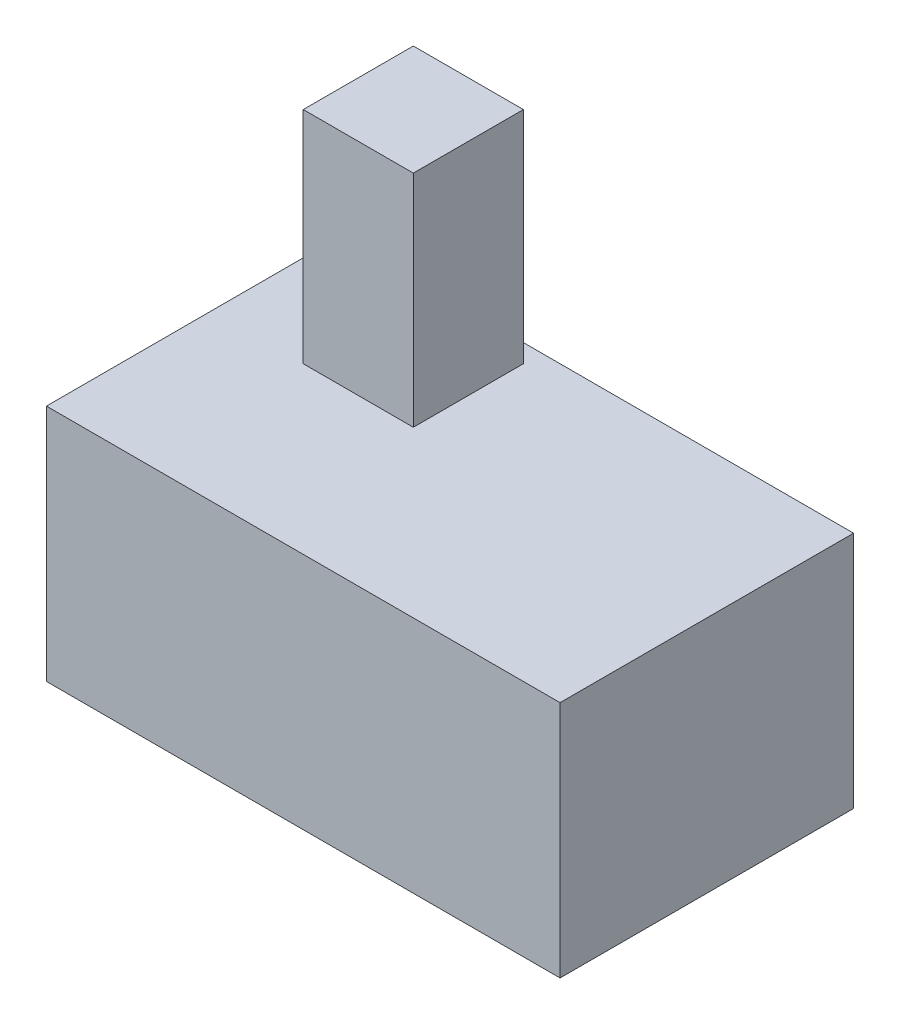
ISO-10303-21;
HEADER;
FILE_DESCRIPTION(('STEP AP214'),'2;1');
FILE_NAME('part.step','',(''),(''),'','','');
FILE_SCHEMA(('AUTOMOTIVE_DESIGN { 1 0 10303 214 1 1 1 1 }'));
ENDSEC;
DATA;
#1=APPLICATION_CONTEXT('core data for automotive mechanical design processes');
#2=APPLICATION_PROTOCOL_DEFINITION('international standard','automotive_design',2000,#1);
#3=PRODUCT_CONTEXT('',#1,'mechanical');
#4=PRODUCT('Part','Part','',(#3));
#5=PRODUCT_RELATED_PRODUCT_CATEGORY('part','',(#4));
#6=PRODUCT_DEFINITION_FORMATION('','',#4);
#7=PRODUCT_DEFINITION_CONTEXT('part definition',#1,'design');
#8=PRODUCT_DEFINITION('design','',#6,#7);
#9=PRODUCT_DEFINITION_SHAPE('','',#8);
#10=(LENGTH_UNIT() NAMED_UNIT(*) SI_UNIT(.MILLI.,.METRE.));
#11=(NAMED_UNIT(*) PLANE_ANGLE_UNIT() SI_UNIT($,.RADIAN.));
#12=(NAMED_UNIT(*) SI_UNIT($,.STERADIAN.) SOLID_ANGLE_UNIT());
#13=UNCERTAINTY_MEASURE_WITH_UNIT(LENGTH_MEASURE(1.E-05),#10,'distance_accuracy_value','');
#14=(GEOMETRIC_REPRESENTATION_CONTEXT(3) GLOBAL_UNCERTAINTY_ASSIGNED_CONTEXT((#13)) GLOBAL_UNIT_ASSIGNED_CONTEXT((#10,
#11,#12)) REPRESENTATION_CONTEXT('',''));
#15=CARTESIAN_POINT('',(0.,0.,0.));
#16=DIRECTION('',(0.,0.,1.));
#17=DIRECTION('',(1.,0.,0.));
#18=AXIS2_PLACEMENT_3D('',#15,#16,#17);
#19=CARTESIAN_POINT('',(0.,6.5,0.));
#20=DIRECTION('',(0.,-1.,0.));
#21=DIRECTION('',(0.,0.,-1.));
#22=AXIS2_PLACEMENT_3D('',#19,#20,#21);
#23=PLANE('',#22);
#24=DIRECTION('',(0.,0.,-1.));
#25=VECTOR('',#24,1.);
#26=CARTESIAN_POINT('',(7.,6.5,4.00000000000002));
#27=LINE('',#26,#25);
#28=CARTESIAN_POINT('',(7.,6.5,4.00000000000002));
#29=VERTEX_POINT('',#28);
#30=CARTESIAN_POINT('',(7.,6.5,-3.99999999999999));
#31=VERTEX_POINT('',#30);
#32=EDGE_CURVE('E130',#29,#31,#27,.T.);
#33=ORIENTED_EDGE('',*,*,#32,.T.);
#34=DIRECTION('',(-1.,0.,0.));
#35=VECTOR('',#34,1.);
#36=CARTESIAN_POINT('',(-7.,6.5,-3.99999999999999));
#37=LINE('',#36,#35);
#38=CARTESIAN_POINT('',(-7.,6.5,-3.99999999999999));
#39=VERTEX_POINT('',#38);
#40=EDGE_CURVE('E133',#31,#39,#37,.T.);
#41=ORIENTED_EDGE('',*,*,#40,.T.);
#42=DIRECTION('',(0.,0.,1.));
#43=VECTOR('',#42,1.);
#44=CARTESIAN_POINT('',(-7.,6.5,4.00000000000002));
#45=LINE('',#44,#43);
#46=CARTESIAN_POINT('',(-7.,6.5,4.00000000000002));
#47=VERTEX_POINT('',#46);
#48=EDGE_CURVE('E136',#39,#47,#45,.T.);
#49=ORIENTED_EDGE('',*,*,#48,.T.);
#50=DIRECTION('',(1.,0.,0.));
#51=VECTOR('',#50,1.);
#52=CARTESIAN_POINT('',(-7.,6.5,4.00000000000002));
#53=LINE('',#52,#51);
#54=EDGE_CURVE('E138',#47,#29,#53,.T.);
#55=ORIENTED_EDGE('',*,*,#54,.T.);
#56=EDGE_LOOP('',(#33,#41,#49,#55));
#57=FACE_BOUND('',#56,.T.);
#58=DIRECTION('',(0.,0.,-1.));
#59=VECTOR('',#58,1.);
#60=CARTESIAN_POINT('',(-1.5,6.5,-0.49999999999999));
#61=LINE('',#60,#59);
#62=CARTESIAN_POINT('',(-1.5,6.5,-0.49999999999999));
#63=VERTEX_POINT('',#62);
#64=CARTESIAN_POINT('',(-1.5,6.5,-3.49999999999999));
#65=VERTEX_POINT('',#64);
#66=EDGE_CURVE('E120',#63,#65,#61,.T.);
#67=ORIENTED_EDGE('',*,*,#66,.F.);
#68=DIRECTION('',(1.,0.,0.));
#69=VECTOR('',#68,1.);
#70=CARTESIAN_POINT('',(-4.5,6.5,-0.49999999999999));
#71=LINE('',#70,#69);
#72=CARTESIAN_POINT('',(-4.5,6.5,-0.49999999999999));
#73=VERTEX_POINT('',#72);
#74=EDGE_CURVE('E117',#73,#63,#71,.T.);
#75=ORIENTED_EDGE('',*,*,#74,.F.);
#76=DIRECTION('',(0.,0.,1.));
#77=VECTOR('',#76,1.);
#78=CARTESIAN_POINT('',(-4.5,6.5,-0.49999999999999));
#79=LINE('',#78,#77);
#80=CARTESIAN_POINT('',(-4.5,6.5,-3.49999999999999));
#81=VERTEX_POINT('',#80);
#82=EDGE_CURVE('E55',#81,#73,#79,.T.);
#83=ORIENTED_EDGE('',*,*,#82,.F.);
#84=DIRECTION('',(-1.,0.,0.));
#85=VECTOR('',#84,1.);
#86=CARTESIAN_POINT('',(-4.5,6.5,-3.49999999999999));
#87=LINE('',#86,#85);
#88=EDGE_CURVE('E50',#65,#81,#87,.T.);
#89=ORIENTED_EDGE('',*,*,#88,.F.);
#90=EDGE_LOOP('',(#67,#75,#83,#89));
#91=FACE_BOUND('',#90,.T.);
#92=ADVANCED_FACE('F35',(#57,#91),#23,.F.);
#93=CARTESIAN_POINT('',(7.,6.5,4.00000000000002));
#94=DIRECTION('',(-1.,0.,0.));
#95=DIRECTION('',(0.,0.,1.));
#96=AXIS2_PLACEMENT_3D('',#93,#94,#95);
#97=PLANE('',#96);
#98=DIRECTION('',(0.,0.,-1.));
#99=VECTOR('',#98,1.);
#100=CARTESIAN_POINT('',(7.,0.,4.00000000000002));
#101=LINE('',#100,#99);
#102=CARTESIAN_POINT('',(7.,0.,4.00000000000002));
#103=VERTEX_POINT('',#102);
#104=CARTESIAN_POINT('',(7.,0.,-3.99999999999999));
#105=VERTEX_POINT('',#104);
#106=EDGE_CURVE('E121',#103,#105,#101,.T.);
#107=ORIENTED_EDGE('',*,*,#106,.T.);
#108=DIRECTION('',(0.,-1.,0.));
#109=VECTOR('',#108,1.);
#110=CARTESIAN_POINT('',(7.,6.5,-3.99999999999999));
#111=LINE('',#110,#109);
#112=EDGE_CURVE('E11',#31,#105,#111,.T.);
#113=ORIENTED_EDGE('',*,*,#112,.F.);
#114=ORIENTED_EDGE('',*,*,#32,.F.);
#115=DIRECTION('',(0.,-1.,0.));
#116=VECTOR('',#115,1.);
#117=CARTESIAN_POINT('',(7.,6.5,4.00000000000002));
#118=LINE('',#117,#116);
#119=EDGE_CURVE('E139',#29,#103,#118,.T.);
#120=ORIENTED_EDGE('',*,*,#119,.T.);
#121=EDGE_LOOP('',(#107,#113,#114,#120));
#122=FACE_BOUND('',#121,.T.);
#123=ADVANCED_FACE('F37',(#122),#97,.F.);
#124=CARTESIAN_POINT('',(-7.,6.5,-3.99999999999999));
#125=DIRECTION('',(0.,0.,1.));
#126=DIRECTION('',(1.,0.,0.));
#127=AXIS2_PLACEMENT_3D('',#124,#125,#126);
#128=PLANE('',#127);
#129=DIRECTION('',(-1.,0.,0.));
#130=VECTOR('',#129,1.);
#131=CARTESIAN_POINT('',(-7.,0.,-3.99999999999999));
#132=LINE('',#131,#130);
#133=CARTESIAN_POINT('',(-7.,0.,-3.99999999999999));
#134=VERTEX_POINT('',#133);
#135=EDGE_CURVE('E124',#105,#134,#132,.T.);
#136=ORIENTED_EDGE('',*,*,#135,.T.);
#137=DIRECTION('',(0.,-1.,0.));
#138=VECTOR('',#137,1.);
#139=CARTESIAN_POINT('',(-7.,6.5,-3.99999999999999));
#140=LINE('',#139,#138);
#141=EDGE_CURVE('E43',#39,#134,#140,.T.);
#142=ORIENTED_EDGE('',*,*,#141,.F.);
#143=ORIENTED_EDGE('',*,*,#40,.F.);
#144=ORIENTED_EDGE('',*,*,#112,.T.);
#145=EDGE_LOOP('',(#136,#142,#143,#144));
#146=FACE_BOUND('',#145,.T.);
#147=ADVANCED_FACE('F169',(#146),#128,.F.);
#148=CARTESIAN_POINT('',(-7.,6.5,4.00000000000002));
#149=DIRECTION('',(1.,0.,0.));
#150=DIRECTION('',(0.,0.,-1.));
#151=AXIS2_PLACEMENT_3D('',#148,#149,#150);
#152=PLANE('',#151);
#153=DIRECTION('',(0.,0.,1.));
#154=VECTOR('',#153,1.);
#155=CARTESIAN_POINT('',(-7.,0.,4.00000000000002));
#156=LINE('',#155,#154);
#157=CARTESIAN_POINT('',(-7.,0.,4.00000000000002));
#158=VERTEX_POINT('',#157);
#159=EDGE_CURVE('E142',#134,#158,#156,.T.);
#160=ORIENTED_EDGE('',*,*,#159,.T.);
#161=DIRECTION('',(0.,-1.,0.));
#162=VECTOR('',#161,1.);
#163=CARTESIAN_POINT('',(-7.,6.5,4.00000000000002));
#164=LINE('',#163,#162);
#165=EDGE_CURVE('E147',#47,#158,#164,.T.);
#166=ORIENTED_EDGE('',*,*,#165,.F.);
#167=ORIENTED_EDGE('',*,*,#48,.F.);
#168=ORIENTED_EDGE('',*,*,#141,.T.);
#169=EDGE_LOOP('',(#160,#166,#167,#168));
#170=FACE_BOUND('',#169,.T.);
#171=ADVANCED_FACE('F154',(#170),#152,.F.);
#172=CARTESIAN_POINT('',(-7.,6.5,4.00000000000002));
#173=DIRECTION('',(0.,0.,-1.));
#174=DIRECTION('',(-1.,0.,0.));
#175=AXIS2_PLACEMENT_3D('',#172,#173,#174);
#176=PLANE('',#175);
#177=DIRECTION('',(1.,0.,0.));
#178=VECTOR('',#177,1.);
#179=CARTESIAN_POINT('',(-7.,0.,4.00000000000002));
#180=LINE('',#179,#178);
#181=EDGE_CURVE('E134',#158,#103,#180,.T.);
#182=ORIENTED_EDGE('',*,*,#181,.T.);
#183=ORIENTED_EDGE('',*,*,#119,.F.);
#184=ORIENTED_EDGE('',*,*,#54,.F.);
#185=ORIENTED_EDGE('',*,*,#165,.T.);
#186=EDGE_LOOP('',(#182,#183,#184,#185));
#187=FACE_BOUND('',#186,.T.);
#188=ADVANCED_FACE('F163',(#187),#176,.F.);
#189=CARTESIAN_POINT('',(0.,0.,0.));
#190=DIRECTION('',(0.,-1.,0.));
#191=DIRECTION('',(0.,0.,-1.));
#192=AXIS2_PLACEMENT_3D('',#189,#190,#191);
#193=PLANE('',#192);
#194=ORIENTED_EDGE('',*,*,#106,.F.);
#195=ORIENTED_EDGE('',*,*,#181,.F.);
#196=ORIENTED_EDGE('',*,*,#159,.F.);
#197=ORIENTED_EDGE('',*,*,#135,.F.);
#198=EDGE_LOOP('',(#194,#195,#196,#197));
#199=FACE_BOUND('',#198,.T.);
#200=ADVANCED_FACE('F160',(#199),#193,.T.);
#201=CARTESIAN_POINT('',(-1.5,12.5,-0.49999999999999));
#202=DIRECTION('',(-1.,0.,0.));
#203=DIRECTION('',(0.,0.,1.));
#204=AXIS2_PLACEMENT_3D('',#201,#202,#203);
#205=PLANE('',#204);
#206=ORIENTED_EDGE('',*,*,#66,.T.);
#207=DIRECTION('',(0.,-1.,0.));
#208=VECTOR('',#207,1.);
#209=CARTESIAN_POINT('',(-1.5,12.5,-3.49999999999999));
#210=LINE('',#209,#208);
#211=CARTESIAN_POINT('',(-1.5,12.5,-3.49999999999999));
#212=VERTEX_POINT('',#211);
#213=EDGE_CURVE('E101',#212,#65,#210,.T.);
#214=ORIENTED_EDGE('',*,*,#213,.F.);
#215=DIRECTION('',(0.,0.,-1.));
#216=VECTOR('',#215,1.);
#217=CARTESIAN_POINT('',(-1.5,12.5,-0.49999999999999));
#218=LINE('',#217,#216);
#219=CARTESIAN_POINT('',(-1.5,12.5,-0.49999999999999));
#220=VERTEX_POINT('',#219);
#221=EDGE_CURVE('E108',#220,#212,#218,.T.);
#222=ORIENTED_EDGE('',*,*,#221,.F.);
#223=DIRECTION('',(0.,-1.,0.));
#224=VECTOR('',#223,1.);
#225=CARTESIAN_POINT('',(-1.5,12.5,-0.49999999999999));
#226=LINE('',#225,#224);
#227=EDGE_CURVE('E262',#220,#63,#226,.T.);
#228=ORIENTED_EDGE('',*,*,#227,.T.);
#229=EDGE_LOOP('',(#206,#214,#222,#228));
#230=FACE_BOUND('',#229,.T.);
#231=ADVANCED_FACE('F119',(#230),#205,.F.);
#232=CARTESIAN_POINT('',(-4.5,12.5,-3.49999999999999));
#233=DIRECTION('',(0.,0.,1.));
#234=DIRECTION('',(1.,0.,0.));
#235=AXIS2_PLACEMENT_3D('',#232,#233,#234);
#236=PLANE('',#235);
#237=ORIENTED_EDGE('',*,*,#88,.T.);
#238=DIRECTION('',(0.,-1.,0.));
#239=VECTOR('',#238,1.);
#240=CARTESIAN_POINT('',(-4.5,12.5,-3.49999999999999));
#241=LINE('',#240,#239);
#242=CARTESIAN_POINT('',(-4.5,12.5,-3.49999999999999));
#243=VERTEX_POINT('',#242);
#244=EDGE_CURVE('E104',#243,#81,#241,.T.);
#245=ORIENTED_EDGE('',*,*,#244,.F.);
#246=DIRECTION('',(-1.,0.,0.));
#247=VECTOR('',#246,1.);
#248=CARTESIAN_POINT('',(-4.5,12.5,-3.49999999999999));
#249=LINE('',#248,#247);
#250=EDGE_CURVE('E97',#212,#243,#249,.T.);
#251=ORIENTED_EDGE('',*,*,#250,.F.);
#252=ORIENTED_EDGE('',*,*,#213,.T.);
#253=EDGE_LOOP('',(#237,#245,#251,#252));
#254=FACE_BOUND('',#253,.T.);
#255=ADVANCED_FACE('F99',(#254),#236,.F.);
#256=CARTESIAN_POINT('',(-4.5,12.5,-0.49999999999999));
#257=DIRECTION('',(1.,0.,0.));
#258=DIRECTION('',(0.,0.,-1.));
#259=AXIS2_PLACEMENT_3D('',#256,#257,#258);
#260=PLANE('',#259);
#261=ORIENTED_EDGE('',*,*,#82,.T.);
#262=DIRECTION('',(0.,-1.,0.));
#263=VECTOR('',#262,1.);
#264=CARTESIAN_POINT('',(-4.5,12.5,-0.49999999999999));
#265=LINE('',#264,#263);
#266=CARTESIAN_POINT('',(-4.5,12.5,-0.49999999999999));
#267=VERTEX_POINT('',#266);
#268=EDGE_CURVE('E126',#267,#73,#265,.T.);
#269=ORIENTED_EDGE('',*,*,#268,.F.);
#270=DIRECTION('',(0.,0.,1.));
#271=VECTOR('',#270,1.);
#272=CARTESIAN_POINT('',(-4.5,12.5,-0.49999999999999));
#273=LINE('',#272,#271);
#274=EDGE_CURVE('E107',#243,#267,#273,.T.);
#275=ORIENTED_EDGE('',*,*,#274,.F.);
#276=ORIENTED_EDGE('',*,*,#244,.T.);
#277=EDGE_LOOP('',(#261,#269,#275,#276));
#278=FACE_BOUND('',#277,.T.);
#279=ADVANCED_FACE('F205',(#278),#260,.F.);
#280=CARTESIAN_POINT('',(-4.5,12.5,-0.49999999999999));
#281=DIRECTION('',(0.,0.,-1.));
#282=DIRECTION('',(-1.,0.,0.));
#283=AXIS2_PLACEMENT_3D('',#280,#281,#282);
#284=PLANE('',#283);
#285=ORIENTED_EDGE('',*,*,#74,.T.);
#286=ORIENTED_EDGE('',*,*,#227,.F.);
#287=DIRECTION('',(1.,0.,0.));
#288=VECTOR('',#287,1.);
#289=CARTESIAN_POINT('',(-4.5,12.5,-0.49999999999999));
#290=LINE('',#289,#288);
#291=EDGE_CURVE('E113',#267,#220,#290,.T.);
#292=ORIENTED_EDGE('',*,*,#291,.F.);
#293=ORIENTED_EDGE('',*,*,#268,.T.);
#294=EDGE_LOOP('',(#285,#286,#292,#293));
#295=FACE_BOUND('',#294,.T.);
#296=ADVANCED_FACE('F211',(#295),#284,.F.);
#297=CARTESIAN_POINT('',(0.,12.5,0.));
#298=DIRECTION('',(0.,-1.,0.));
#299=DIRECTION('',(0.,0.,-1.));
#300=AXIS2_PLACEMENT_3D('',#297,#298,#299);
#301=PLANE('',#300);
#302=ORIENTED_EDGE('',*,*,#221,.T.);
#303=ORIENTED_EDGE('',*,*,#250,.T.);
#304=ORIENTED_EDGE('',*,*,#274,.T.);
#305=ORIENTED_EDGE('',*,*,#291,.T.);
#306=EDGE_LOOP('',(#302,#303,#304,#305));
#307=FACE_BOUND('',#306,.T.);
#308=ADVANCED_FACE('F111',(#307),#301,.F.);
#309=CLOSED_SHELL('',(#92,#123,#147,#171,#188,#200,#231,#255,#279,#296,#308));
#310=MANIFOLD_SOLID_BREP('B2',#309);
#311=ADVANCED_BREP_SHAPE_REPRESENTATION('',(#18,#310),#14);
#312=SHAPE_DEFINITION_REPRESENTATION(#9,#311);
ENDSEC;
END-ISO-10303-21;
